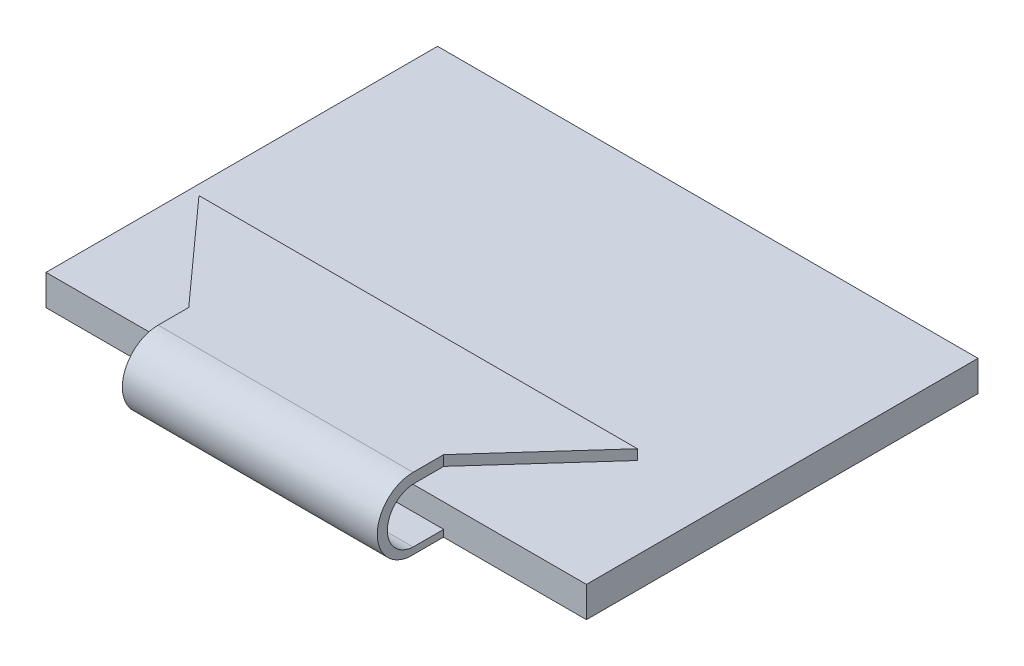
ISO-10303-21;
HEADER;
FILE_DESCRIPTION(('STEP AP214'),'2;1');
FILE_NAME('part.step','',(''),(''),'','','');
FILE_SCHEMA(('AUTOMOTIVE_DESIGN { 1 0 10303 214 1 1 1 1 }'));
ENDSEC;
DATA;
#1=APPLICATION_CONTEXT('core data for automotive mechanical design processes');
#2=APPLICATION_PROTOCOL_DEFINITION('international standard','automotive_design',2000,#1);
#3=PRODUCT_CONTEXT('',#1,'mechanical');
#4=PRODUCT('Part','Part','',(#3));
#5=PRODUCT_RELATED_PRODUCT_CATEGORY('part','',(#4));
#6=PRODUCT_DEFINITION_FORMATION('','',#4);
#7=PRODUCT_DEFINITION_CONTEXT('part definition',#1,'design');
#8=PRODUCT_DEFINITION('design','',#6,#7);
#9=PRODUCT_DEFINITION_SHAPE('','',#8);
#10=(LENGTH_UNIT() NAMED_UNIT(*) SI_UNIT(.MILLI.,.METRE.));
#11=(NAMED_UNIT(*) PLANE_ANGLE_UNIT() SI_UNIT($,.RADIAN.));
#12=(NAMED_UNIT(*) SI_UNIT($,.STERADIAN.) SOLID_ANGLE_UNIT());
#13=UNCERTAINTY_MEASURE_WITH_UNIT(LENGTH_MEASURE(1.E-05),#10,'distance_accuracy_value','');
#14=(GEOMETRIC_REPRESENTATION_CONTEXT(3) GLOBAL_UNCERTAINTY_ASSIGNED_CONTEXT((#13)) GLOBAL_UNIT_ASSIGNED_CONTEXT((#10,
#11,#12)) REPRESENTATION_CONTEXT('',''));
#15=CARTESIAN_POINT('',(0.,0.,0.));
#16=DIRECTION('',(0.,0.,1.));
#17=DIRECTION('',(1.,0.,0.));
#18=AXIS2_PLACEMENT_3D('',#15,#16,#17);
#19=CARTESIAN_POINT('',(-9.28260869565218,1.5,-6.52173913043478));
#20=DIRECTION('',(1.,0.,0.));
#21=DIRECTION('',(0.,0.,-1.));
#22=AXIS2_PLACEMENT_3D('',#19,#20,#21);
#23=PLANE('',#22);
#24=DIRECTION('',(0.,0.,1.));
#25=VECTOR('',#24,1.);
#26=CARTESIAN_POINT('',(-9.28260869565218,0.,-6.52173913043478));
#27=LINE('',#26,#25);
#28=CARTESIAN_POINT('',(-9.28260869565218,0.,-6.52173913043478));
#29=VERTEX_POINT('',#28);
#30=CARTESIAN_POINT('',(-9.28260869565218,0.,12.6782608695652));
#31=VERTEX_POINT('',#30);
#32=EDGE_CURVE('E235',#29,#31,#27,.T.);
#33=ORIENTED_EDGE('',*,*,#32,.T.);
#34=DIRECTION('',(0.,-1.,0.));
#35=VECTOR('',#34,1.);
#36=CARTESIAN_POINT('',(-9.28260869565218,1.5,12.6782608695652));
#37=LINE('',#36,#35);
#38=CARTESIAN_POINT('',(-9.28260869565218,1.5,12.6782608695652));
#39=VERTEX_POINT('',#38);
#40=EDGE_CURVE('E267',#39,#31,#37,.T.);
#41=ORIENTED_EDGE('',*,*,#40,.F.);
#42=DIRECTION('',(0.,0.,1.));
#43=VECTOR('',#42,1.);
#44=CARTESIAN_POINT('',(-9.28260869565218,1.5,-6.52173913043478));
#45=LINE('',#44,#43);
#46=CARTESIAN_POINT('',(-9.28260869565218,1.5,-6.52173913043478));
#47=VERTEX_POINT('',#46);
#48=EDGE_CURVE('E241',#47,#39,#45,.T.);
#49=ORIENTED_EDGE('',*,*,#48,.F.);
#50=DIRECTION('',(0.,-1.,0.));
#51=VECTOR('',#50,1.);
#52=CARTESIAN_POINT('',(-9.28260869565218,1.5,-6.52173913043478));
#53=LINE('',#52,#51);
#54=EDGE_CURVE('E251',#47,#29,#53,.T.);
#55=ORIENTED_EDGE('',*,*,#54,.T.);
#56=EDGE_LOOP('',(#33,#41,#49,#55));
#57=FACE_BOUND('',#56,.T.);
#58=ADVANCED_FACE('F64',(#57),#23,.F.);
#59=CARTESIAN_POINT('',(-9.28260869565218,1.5,12.6782608695652));
#60=DIRECTION('',(0.,0.,-1.));
#61=DIRECTION('',(-1.,0.,0.));
#62=AXIS2_PLACEMENT_3D('',#59,#60,#61);
#63=PLANE('',#62);
#64=DIRECTION('',(-1.,0.,0.));
#65=VECTOR('',#64,1.);
#66=CARTESIAN_POINT('',(15.7173913043478,0.336807219337487,12.6782608695652));
#67=LINE('',#66,#65);
#68=CARTESIAN_POINT('',(10.2173913043478,0.336807219337487,12.6782608695652));
#69=VERTEX_POINT('',#68);
#70=CARTESIAN_POINT('',(-2.28260869565218,0.336807219337487,12.6782608695652));
#71=VERTEX_POINT('',#70);
#72=EDGE_CURVE('E220',#69,#71,#67,.T.);
#73=ORIENTED_EDGE('',*,*,#72,.F.);
#74=DIRECTION('',(0.,1.,0.));
#75=VECTOR('',#74,1.);
#76=CARTESIAN_POINT('',(10.2173913043478,0.01,12.6782608695652));
#77=LINE('',#76,#75);
#78=CARTESIAN_POINT('',(10.2173913043478,0.01,12.6782608695652));
#79=VERTEX_POINT('',#78);
#80=EDGE_CURVE('E228',#79,#69,#77,.T.);
#81=ORIENTED_EDGE('',*,*,#80,.F.);
#82=DIRECTION('',(1.,0.,0.));
#83=VECTOR('',#82,1.);
#84=CARTESIAN_POINT('',(-2.28260869565218,0.01,12.6782608695652));
#85=LINE('',#84,#83);
#86=CARTESIAN_POINT('',(-2.28260869565218,0.01,12.6782608695652));
#87=VERTEX_POINT('',#86);
#88=EDGE_CURVE('E231',#87,#79,#85,.T.);
#89=ORIENTED_EDGE('',*,*,#88,.F.);
#90=DIRECTION('',(0.,1.,0.));
#91=VECTOR('',#90,1.);
#92=CARTESIAN_POINT('',(-2.28260869565218,0.01,12.6782608695652));
#93=LINE('',#92,#91);
#94=EDGE_CURVE('E225',#87,#71,#93,.T.);
#95=ORIENTED_EDGE('',*,*,#94,.T.);
#96=EDGE_LOOP('',(#73,#81,#89,#95));
#97=FACE_BOUND('',#96,.T.);
#98=DIRECTION('',(0.,-1.,0.));
#99=VECTOR('',#98,1.);
#100=CARTESIAN_POINT('',(17.2173913043478,1.5,12.6782608695652));
#101=LINE('',#100,#99);
#102=CARTESIAN_POINT('',(17.2173913043478,1.5,12.6782608695652));
#103=VERTEX_POINT('',#102);
#104=CARTESIAN_POINT('',(17.2173913043478,0.,12.6782608695652));
#105=VERTEX_POINT('',#104);
#106=EDGE_CURVE('E264',#103,#105,#101,.T.);
#107=ORIENTED_EDGE('',*,*,#106,.F.);
#108=DIRECTION('',(1.,0.,0.));
#109=VECTOR('',#108,1.);
#110=CARTESIAN_POINT('',(-9.28260869565218,1.5,12.6782608695652));
#111=LINE('',#110,#109);
#112=EDGE_CURVE('E244',#39,#103,#111,.T.);
#113=ORIENTED_EDGE('',*,*,#112,.F.);
#114=ORIENTED_EDGE('',*,*,#40,.T.);
#115=DIRECTION('',(1.,0.,0.));
#116=VECTOR('',#115,1.);
#117=CARTESIAN_POINT('',(-9.28260869565218,0.,12.6782608695652));
#118=LINE('',#117,#116);
#119=EDGE_CURVE('E254',#31,#105,#118,.T.);
#120=ORIENTED_EDGE('',*,*,#119,.T.);
#121=EDGE_LOOP('',(#107,#113,#114,#120));
#122=FACE_BOUND('',#121,.T.);
#123=ADVANCED_FACE('F287',(#97,#122),#63,.F.);
#124=CARTESIAN_POINT('',(17.2173913043478,1.5,-6.52173913043478));
#125=DIRECTION('',(-1.,0.,0.));
#126=DIRECTION('',(0.,0.,1.));
#127=AXIS2_PLACEMENT_3D('',#124,#125,#126);
#128=PLANE('',#127);
#129=DIRECTION('',(0.,0.,-1.));
#130=VECTOR('',#129,1.);
#131=CARTESIAN_POINT('',(17.2173913043478,0.,-6.52173913043478));
#132=LINE('',#131,#130);
#133=CARTESIAN_POINT('',(17.2173913043478,0.,-6.52173913043478));
#134=VERTEX_POINT('',#133);
#135=EDGE_CURVE('E256',#105,#134,#132,.T.);
#136=ORIENTED_EDGE('',*,*,#135,.T.);
#137=DIRECTION('',(0.,-1.,0.));
#138=VECTOR('',#137,1.);
#139=CARTESIAN_POINT('',(17.2173913043478,1.5,-6.52173913043478));
#140=LINE('',#139,#138);
#141=CARTESIAN_POINT('',(17.2173913043478,1.5,-6.52173913043478));
#142=VERTEX_POINT('',#141);
#143=EDGE_CURVE('E261',#142,#134,#140,.T.);
#144=ORIENTED_EDGE('',*,*,#143,.F.);
#145=DIRECTION('',(0.,0.,-1.));
#146=VECTOR('',#145,1.);
#147=CARTESIAN_POINT('',(17.2173913043478,1.5,-6.52173913043478));
#148=LINE('',#147,#146);
#149=EDGE_CURVE('E247',#103,#142,#148,.T.);
#150=ORIENTED_EDGE('',*,*,#149,.F.);
#151=ORIENTED_EDGE('',*,*,#106,.T.);
#152=EDGE_LOOP('',(#136,#144,#150,#151));
#153=FACE_BOUND('',#152,.T.);
#154=ADVANCED_FACE('F318',(#153),#128,.F.);
#155=CARTESIAN_POINT('',(-9.28260869565218,1.5,-6.52173913043478));
#156=DIRECTION('',(0.,0.,1.));
#157=DIRECTION('',(1.,0.,0.));
#158=AXIS2_PLACEMENT_3D('',#155,#156,#157);
#159=PLANE('',#158);
#160=DIRECTION('',(-1.,0.,0.));
#161=VECTOR('',#160,1.);
#162=CARTESIAN_POINT('',(-9.28260869565218,0.,-6.52173913043478));
#163=LINE('',#162,#161);
#164=EDGE_CURVE('E245',#134,#29,#163,.T.);
#165=ORIENTED_EDGE('',*,*,#164,.T.);
#166=ORIENTED_EDGE('',*,*,#54,.F.);
#167=DIRECTION('',(-1.,0.,0.));
#168=VECTOR('',#167,1.);
#169=CARTESIAN_POINT('',(-9.28260869565218,1.5,-6.52173913043478));
#170=LINE('',#169,#168);
#171=EDGE_CURVE('E249',#142,#47,#170,.T.);
#172=ORIENTED_EDGE('',*,*,#171,.F.);
#173=ORIENTED_EDGE('',*,*,#143,.T.);
#174=EDGE_LOOP('',(#165,#166,#172,#173));
#175=FACE_BOUND('',#174,.T.);
#176=ADVANCED_FACE('F334',(#175),#159,.F.);
#177=CARTESIAN_POINT('',(0.,1.5,0.));
#178=DIRECTION('',(0.,1.,0.));
#179=DIRECTION('',(0.,0.,1.));
#180=AXIS2_PLACEMENT_3D('',#177,#178,#179);
#181=PLANE('',#180);
#182=ORIENTED_EDGE('',*,*,#48,.T.);
#183=ORIENTED_EDGE('',*,*,#112,.T.);
#184=ORIENTED_EDGE('',*,*,#149,.T.);
#185=ORIENTED_EDGE('',*,*,#171,.T.);
#186=EDGE_LOOP('',(#182,#183,#184,#185));
#187=FACE_BOUND('',#186,.T.);
#188=ADVANCED_FACE('F330',(#187),#181,.T.);
#189=CARTESIAN_POINT('',(0.,0.,0.));
#190=DIRECTION('',(0.,1.,0.));
#191=DIRECTION('',(0.,0.,1.));
#192=AXIS2_PLACEMENT_3D('',#189,#190,#191);
#193=PLANE('',#192);
#194=ORIENTED_EDGE('',*,*,#32,.F.);
#195=ORIENTED_EDGE('',*,*,#164,.F.);
#196=ORIENTED_EDGE('',*,*,#135,.F.);
#197=ORIENTED_EDGE('',*,*,#119,.F.);
#198=EDGE_LOOP('',(#194,#195,#196,#197));
#199=FACE_BOUND('',#198,.T.);
#200=ADVANCED_FACE('F325',(#199),#193,.F.);
#201=CARTESIAN_POINT('',(-2.28260869565218,0.01,16.1782608695652));
#202=DIRECTION('',(-1.,0.,0.));
#203=DIRECTION('',(0.,0.,1.));
#204=AXIS2_PLACEMENT_3D('',#201,#202,#203);
#205=PLANE('',#204);
#206=DIRECTION('',(0.,1.,0.));
#207=VECTOR('',#206,1.);
#208=CARTESIAN_POINT('',(-2.28260869565218,3.01,12.6782608695652));
#209=LINE('',#208,#207);
#210=CARTESIAN_POINT('',(-2.28260869565218,3.01,12.6782608695652));
#211=VERTEX_POINT('',#210);
#212=CARTESIAN_POINT('',(-2.28260869565218,3.51,12.6782608695652));
#213=VERTEX_POINT('',#212);
#214=EDGE_CURVE('E199',#211,#213,#209,.T.);
#215=ORIENTED_EDGE('',*,*,#214,.F.);
#216=DIRECTION('',(0.,0.,1.));
#217=VECTOR('',#216,1.);
#218=CARTESIAN_POINT('',(-2.28260869565218,3.01,0.));
#219=LINE('',#218,#217);
#220=CARTESIAN_POINT('',(-2.28260869565218,3.01,14.1782608695652));
#221=VERTEX_POINT('',#220);
#222=EDGE_CURVE('E212',#211,#221,#219,.T.);
#223=ORIENTED_EDGE('',*,*,#222,.T.);
#224=CARTESIAN_POINT('',(-2.28260869565218,1.67340360966874,14.1006967219777));
#225=DIRECTION('',(-1.,0.,0.));
#226=DIRECTION('',(0.,0.,1.));
#227=AXIS2_PLACEMENT_3D('',#224,#225,#226);
#228=CIRCLE('',#227,1.33884506483667);
#229=CARTESIAN_POINT('',(-2.28260869565218,0.336807219337487,14.1782608695652));
#230=VERTEX_POINT('',#229);
#231=EDGE_CURVE('E208',#221,#230,#228,.F.);
#232=ORIENTED_EDGE('',*,*,#231,.T.);
#233=DIRECTION('',(0.,0.,1.));
#234=VECTOR('',#233,1.);
#235=CARTESIAN_POINT('',(-2.28260869565218,0.336807219337487,0.));
#236=LINE('',#235,#234);
#237=EDGE_CURVE('E214',#71,#230,#236,.T.);
#238=ORIENTED_EDGE('',*,*,#237,.F.);
#239=ORIENTED_EDGE('',*,*,#94,.F.);
#240=DIRECTION('',(0.,0.,-1.));
#241=VECTOR('',#240,1.);
#242=CARTESIAN_POINT('',(-2.28260869565218,0.01,16.1782608695652));
#243=LINE('',#242,#241);
#244=CARTESIAN_POINT('',(-2.28260869565218,0.01,14.3922941355446));
#245=VERTEX_POINT('',#244);
#246=EDGE_CURVE('E86',#245,#87,#243,.T.);
#247=ORIENTED_EDGE('',*,*,#246,.F.);
#248=CARTESIAN_POINT('',(-2.28260869565218,1.75345495293558,14.1782489777102));
#249=DIRECTION('',(-1.,0.,0.));
#250=DIRECTION('',(0.,0.,1.));
#251=AXIS2_PLACEMENT_3D('',#248,#249,#250);
#252=CIRCLE('',#251,1.75654504710467);
#253=CARTESIAN_POINT('',(-2.28260869565218,3.51,14.1782608695652));
#254=VERTEX_POINT('',#253);
#255=EDGE_CURVE('E177',#254,#245,#252,.F.);
#256=ORIENTED_EDGE('',*,*,#255,.F.);
#257=DIRECTION('',(0.,0.,-1.));
#258=VECTOR('',#257,1.);
#259=CARTESIAN_POINT('',(-2.28260869565218,3.51,16.1782608695652));
#260=LINE('',#259,#258);
#261=EDGE_CURVE('E233',#254,#213,#260,.T.);
#262=ORIENTED_EDGE('',*,*,#261,.T.);
#263=EDGE_LOOP('',(#215,#223,#232,#238,#239,#247,#256,#262));
#264=FACE_BOUND('',#263,.T.);
#265=ADVANCED_FACE('F294',(#264),#205,.T.);
#266=CARTESIAN_POINT('',(-2.28260869565218,0.01,16.1782608695652));
#267=DIRECTION('',(0.,1.,0.));
#268=DIRECTION('',(0.,0.,1.));
#269=AXIS2_PLACEMENT_3D('',#266,#267,#268);
#270=PLANE('',#269);
#271=DIRECTION('',(0.,0.,-1.));
#272=VECTOR('',#271,1.);
#273=CARTESIAN_POINT('',(10.2173913043478,0.01,16.1782608695652));
#274=LINE('',#273,#272);
#275=CARTESIAN_POINT('',(10.2173913043478,0.01,14.3922941355446));
#276=VERTEX_POINT('',#275);
#277=EDGE_CURVE('E236',#276,#79,#274,.T.);
#278=ORIENTED_EDGE('',*,*,#277,.F.);
#279=DIRECTION('',(-1.,0.,0.));
#280=VECTOR('',#279,1.);
#281=CARTESIAN_POINT('',(15.7173913043478,0.01,14.3922941355446));
#282=LINE('',#281,#280);
#283=EDGE_CURVE('E206',#276,#245,#282,.T.);
#284=ORIENTED_EDGE('',*,*,#283,.T.);
#285=ORIENTED_EDGE('',*,*,#246,.T.);
#286=ORIENTED_EDGE('',*,*,#88,.T.);
#287=EDGE_LOOP('',(#278,#284,#285,#286));
#288=FACE_BOUND('',#287,.T.);
#289=ADVANCED_FACE('F290',(#288),#270,.F.);
#290=CARTESIAN_POINT('',(10.2173913043478,0.01,16.1782608695652));
#291=DIRECTION('',(-1.,0.,0.));
#292=DIRECTION('',(0.,0.,1.));
#293=AXIS2_PLACEMENT_3D('',#290,#291,#292);
#294=PLANE('',#293);
#295=DIRECTION('',(0.,0.,1.));
#296=VECTOR('',#295,1.);
#297=CARTESIAN_POINT('',(10.2173913043478,3.01,16.1782608695652));
#298=LINE('',#297,#296);
#299=CARTESIAN_POINT('',(10.2173913043478,3.01,12.6782608695652));
#300=VERTEX_POINT('',#299);
#301=CARTESIAN_POINT('',(10.2173913043478,3.01,14.1782608695652));
#302=VERTEX_POINT('',#301);
#303=EDGE_CURVE('E270',#300,#302,#298,.T.);
#304=ORIENTED_EDGE('',*,*,#303,.F.);
#305=DIRECTION('',(0.,1.,0.));
#306=VECTOR('',#305,1.);
#307=CARTESIAN_POINT('',(10.2173913043478,3.01,12.6782608695652));
#308=LINE('',#307,#306);
#309=CARTESIAN_POINT('',(10.2173913043478,3.51,12.6782608695652));
#310=VERTEX_POINT('',#309);
#311=EDGE_CURVE('E186',#300,#310,#308,.T.);
#312=ORIENTED_EDGE('',*,*,#311,.T.);
#313=DIRECTION('',(0.,0.,-1.));
#314=VECTOR('',#313,1.);
#315=CARTESIAN_POINT('',(10.2173913043478,3.51,16.1782608695652));
#316=LINE('',#315,#314);
#317=CARTESIAN_POINT('',(10.2173913043478,3.51,14.1782608695652));
#318=VERTEX_POINT('',#317);
#319=EDGE_CURVE('E191',#318,#310,#316,.T.);
#320=ORIENTED_EDGE('',*,*,#319,.F.);
#321=CARTESIAN_POINT('',(10.2173913043478,1.75345495293558,14.1782489777102));
#322=DIRECTION('',(-1.,0.,0.));
#323=DIRECTION('',(0.,0.,1.));
#324=AXIS2_PLACEMENT_3D('',#321,#322,#323);
#325=CIRCLE('',#324,1.75654504710467);
#326=EDGE_CURVE('E78',#318,#276,#325,.F.);
#327=ORIENTED_EDGE('',*,*,#326,.T.);
#328=ORIENTED_EDGE('',*,*,#277,.T.);
#329=ORIENTED_EDGE('',*,*,#80,.T.);
#330=DIRECTION('',(0.,0.,1.));
#331=VECTOR('',#330,1.);
#332=CARTESIAN_POINT('',(10.2173913043478,0.336807219337487,16.1782608695652));
#333=LINE('',#332,#331);
#334=CARTESIAN_POINT('',(10.2173913043478,0.336807219337487,14.1782608695652));
#335=VERTEX_POINT('',#334);
#336=EDGE_CURVE('E12',#69,#335,#333,.T.);
#337=ORIENTED_EDGE('',*,*,#336,.T.);
#338=CARTESIAN_POINT('',(10.2173913043478,1.67340360966874,14.1006967219777));
#339=DIRECTION('',(-1.,0.,0.));
#340=DIRECTION('',(0.,0.,1.));
#341=AXIS2_PLACEMENT_3D('',#338,#339,#340);
#342=CIRCLE('',#341,1.33884506483667);
#343=EDGE_CURVE('E71',#302,#335,#342,.F.);
#344=ORIENTED_EDGE('',*,*,#343,.F.);
#345=EDGE_LOOP('',(#304,#312,#320,#327,#328,#329,#337,#344));
#346=FACE_BOUND('',#345,.T.);
#347=ADVANCED_FACE('F283',(#346),#294,.F.);
#348=CARTESIAN_POINT('',(-2.28260869565218,3.51,16.1782608695652));
#349=DIRECTION('',(0.,1.,0.));
#350=DIRECTION('',(0.,0.,1.));
#351=AXIS2_PLACEMENT_3D('',#348,#349,#350);
#352=PLANE('',#351);
#353=DIRECTION('',(-1.,0.,0.));
#354=VECTOR('',#353,1.);
#355=CARTESIAN_POINT('',(15.7173913043478,3.51,14.1782608695652));
#356=LINE('',#355,#354);
#357=EDGE_CURVE('E205',#318,#254,#356,.T.);
#358=ORIENTED_EDGE('',*,*,#357,.F.);
#359=ORIENTED_EDGE('',*,*,#319,.T.);
#360=DIRECTION('',(0.66896473162245,0.,-0.743294146247166));
#361=VECTOR('',#360,1.);
#362=CARTESIAN_POINT('',(14.7173913043478,3.51,7.67826086956522));
#363=LINE('',#362,#361);
#364=CARTESIAN_POINT('',(14.7173913043478,3.51,7.67826086956522));
#365=VERTEX_POINT('',#364);
#366=EDGE_CURVE('E182',#310,#365,#363,.T.);
#367=ORIENTED_EDGE('',*,*,#366,.T.);
#368=DIRECTION('',(1.,0.,0.));
#369=VECTOR('',#368,1.);
#370=CARTESIAN_POINT('',(10.2173913043478,3.51,7.67826086956522));
#371=LINE('',#370,#369);
#372=CARTESIAN_POINT('',(-6.78260869565218,3.51,7.67826086956522));
#373=VERTEX_POINT('',#372);
#374=EDGE_CURVE('E166',#373,#365,#371,.T.);
#375=ORIENTED_EDGE('',*,*,#374,.F.);
#376=DIRECTION('',(0.66896473162245,0.,0.743294146247166));
#377=VECTOR('',#376,1.);
#378=CARTESIAN_POINT('',(-6.78260869565218,3.51,7.67826086956522));
#379=LINE('',#378,#377);
#380=EDGE_CURVE('E192',#373,#213,#379,.T.);
#381=ORIENTED_EDGE('',*,*,#380,.T.);
#382=ORIENTED_EDGE('',*,*,#261,.F.);
#383=EDGE_LOOP('',(#358,#359,#367,#375,#381,#382));
#384=FACE_BOUND('',#383,.T.);
#385=ADVANCED_FACE('F189',(#384),#352,.T.);
#386=CARTESIAN_POINT('',(15.7173913043478,1.75345495293558,14.1782489777102));
#387=DIRECTION('',(-1.,0.,0.));
#388=DIRECTION('',(0.,0.,1.));
#389=AXIS2_PLACEMENT_3D('',#386,#387,#388);
#390=CYLINDRICAL_SURFACE('',#389,1.75654504710467);
#391=ORIENTED_EDGE('',*,*,#357,.T.);
#392=ORIENTED_EDGE('',*,*,#255,.T.);
#393=ORIENTED_EDGE('',*,*,#283,.F.);
#394=ORIENTED_EDGE('',*,*,#326,.F.);
#395=EDGE_LOOP('',(#391,#392,#393,#394));
#396=FACE_BOUND('',#395,.T.);
#397=ADVANCED_FACE('F302',(#396),#390,.T.);
#398=CARTESIAN_POINT('',(15.7173913043478,1.67340360966874,14.1006967219777));
#399=DIRECTION('',(-1.,0.,0.));
#400=DIRECTION('',(0.,0.,1.));
#401=AXIS2_PLACEMENT_3D('',#398,#399,#400);
#402=CYLINDRICAL_SURFACE('',#401,1.33884506483667);
#403=ORIENTED_EDGE('',*,*,#343,.T.);
#404=DIRECTION('',(-1.,0.,0.));
#405=VECTOR('',#404,1.);
#406=CARTESIAN_POINT('',(15.7173913043478,0.336807219337487,14.1782608695652));
#407=LINE('',#406,#405);
#408=EDGE_CURVE('E218',#335,#230,#407,.T.);
#409=ORIENTED_EDGE('',*,*,#408,.T.);
#410=ORIENTED_EDGE('',*,*,#231,.F.);
#411=DIRECTION('',(-1.,0.,0.));
#412=VECTOR('',#411,1.);
#413=CARTESIAN_POINT('',(15.7173913043478,3.01,14.1782608695652));
#414=LINE('',#413,#412);
#415=EDGE_CURVE('E217',#302,#221,#414,.T.);
#416=ORIENTED_EDGE('',*,*,#415,.F.);
#417=EDGE_LOOP('',(#403,#409,#410,#416));
#418=FACE_BOUND('',#417,.T.);
#419=ADVANCED_FACE('F275',(#418),#402,.F.);
#420=CARTESIAN_POINT('',(15.7173913043478,0.336807219337487,0.));
#421=DIRECTION('',(0.,-1.,0.));
#422=DIRECTION('',(0.,0.,-1.));
#423=AXIS2_PLACEMENT_3D('',#420,#421,#422);
#424=PLANE('',#423);
#425=ORIENTED_EDGE('',*,*,#72,.T.);
#426=ORIENTED_EDGE('',*,*,#237,.T.);
#427=ORIENTED_EDGE('',*,*,#408,.F.);
#428=ORIENTED_EDGE('',*,*,#336,.F.);
#429=EDGE_LOOP('',(#425,#426,#427,#428));
#430=FACE_BOUND('',#429,.T.);
#431=ADVANCED_FACE('F280',(#430),#424,.F.);
#432=CARTESIAN_POINT('',(15.7173913043478,3.01,0.));
#433=DIRECTION('',(0.,-1.,0.));
#434=DIRECTION('',(0.,0.,-1.));
#435=AXIS2_PLACEMENT_3D('',#432,#433,#434);
#436=PLANE('',#435);
#437=DIRECTION('',(-1.,0.,0.));
#438=VECTOR('',#437,1.);
#439=CARTESIAN_POINT('',(10.2173913043478,3.01,7.67826086956522));
#440=LINE('',#439,#438);
#441=CARTESIAN_POINT('',(14.7173913043478,3.01,7.67826086956522));
#442=VERTEX_POINT('',#441);
#443=CARTESIAN_POINT('',(-6.78260869565218,3.01,7.67826086956522));
#444=VERTEX_POINT('',#443);
#445=EDGE_CURVE('E178',#442,#444,#440,.T.);
#446=ORIENTED_EDGE('',*,*,#445,.F.);
#447=DIRECTION('',(0.66896473162245,0.,-0.743294146247166));
#448=VECTOR('',#447,1.);
#449=CARTESIAN_POINT('',(14.7173913043478,3.01,7.67826086956522));
#450=LINE('',#449,#448);
#451=EDGE_CURVE('E185',#300,#442,#450,.T.);
#452=ORIENTED_EDGE('',*,*,#451,.F.);
#453=ORIENTED_EDGE('',*,*,#303,.T.);
#454=ORIENTED_EDGE('',*,*,#415,.T.);
#455=ORIENTED_EDGE('',*,*,#222,.F.);
#456=DIRECTION('',(0.66896473162245,0.,0.743294146247166));
#457=VECTOR('',#456,1.);
#458=CARTESIAN_POINT('',(-6.78260869565218,3.01,7.67826086956522));
#459=LINE('',#458,#457);
#460=EDGE_CURVE('E194',#444,#211,#459,.T.);
#461=ORIENTED_EDGE('',*,*,#460,.F.);
#462=EDGE_LOOP('',(#446,#452,#453,#454,#455,#461));
#463=FACE_BOUND('',#462,.T.);
#464=ADVANCED_FACE('F299',(#463),#436,.T.);
#465=CARTESIAN_POINT('',(0.,0.,7.67826086956522));
#466=DIRECTION('',(0.,0.,-1.));
#467=DIRECTION('',(-1.,0.,0.));
#468=AXIS2_PLACEMENT_3D('',#465,#466,#467);
#469=PLANE('',#468);
#470=ORIENTED_EDGE('',*,*,#374,.T.);
#471=DIRECTION('',(0.,1.,0.));
#472=VECTOR('',#471,1.);
#473=CARTESIAN_POINT('',(14.7173913043478,3.01,7.67826086956522));
#474=LINE('',#473,#472);
#475=EDGE_CURVE('E169',#442,#365,#474,.T.);
#476=ORIENTED_EDGE('',*,*,#475,.F.);
#477=ORIENTED_EDGE('',*,*,#445,.T.);
#478=DIRECTION('',(0.,1.,0.));
#479=VECTOR('',#478,1.);
#480=CARTESIAN_POINT('',(-6.78260869565218,3.01,7.67826086956522));
#481=LINE('',#480,#479);
#482=EDGE_CURVE('E172',#444,#373,#481,.T.);
#483=ORIENTED_EDGE('',*,*,#482,.T.);
#484=EDGE_LOOP('',(#470,#476,#477,#483));
#485=FACE_BOUND('',#484,.T.);
#486=ADVANCED_FACE('F168',(#485),#469,.T.);
#487=CARTESIAN_POINT('',(-6.78260869565218,3.01,7.67826086956522));
#488=DIRECTION('',(-0.743294146247166,0.,0.66896473162245));
#489=DIRECTION('',(0.66896473162245,0.,0.743294146247166));
#490=AXIS2_PLACEMENT_3D('',#487,#488,#489);
#491=PLANE('',#490);
#492=ORIENTED_EDGE('',*,*,#380,.F.);
#493=ORIENTED_EDGE('',*,*,#482,.F.);
#494=ORIENTED_EDGE('',*,*,#460,.T.);
#495=ORIENTED_EDGE('',*,*,#214,.T.);
#496=EDGE_LOOP('',(#492,#493,#494,#495));
#497=FACE_BOUND('',#496,.T.);
#498=ADVANCED_FACE('F301',(#497),#491,.T.);
#499=CARTESIAN_POINT('',(14.7173913043478,3.01,7.67826086956522));
#500=DIRECTION('',(0.743294146247166,0.,0.66896473162245));
#501=DIRECTION('',(0.66896473162245,0.,-0.743294146247166));
#502=AXIS2_PLACEMENT_3D('',#499,#500,#501);
#503=PLANE('',#502);
#504=ORIENTED_EDGE('',*,*,#366,.F.);
#505=ORIENTED_EDGE('',*,*,#311,.F.);
#506=ORIENTED_EDGE('',*,*,#451,.T.);
#507=ORIENTED_EDGE('',*,*,#475,.T.);
#508=EDGE_LOOP('',(#504,#505,#506,#507));
#509=FACE_BOUND('',#508,.T.);
#510=ADVANCED_FACE('F181',(#509),#503,.T.);
#511=CLOSED_SHELL('',(#58,#123,#154,#176,#188,#200,#265,#289,#347,#385,#397,#419,#431,#464,#486,
#498,#510));
#512=MANIFOLD_SOLID_BREP('B2',#511);
#513=ADVANCED_BREP_SHAPE_REPRESENTATION('',(#18,#512),#14);
#514=SHAPE_DEFINITION_REPRESENTATION(#9,#513);
ENDSEC;
END-ISO-10303-21;
